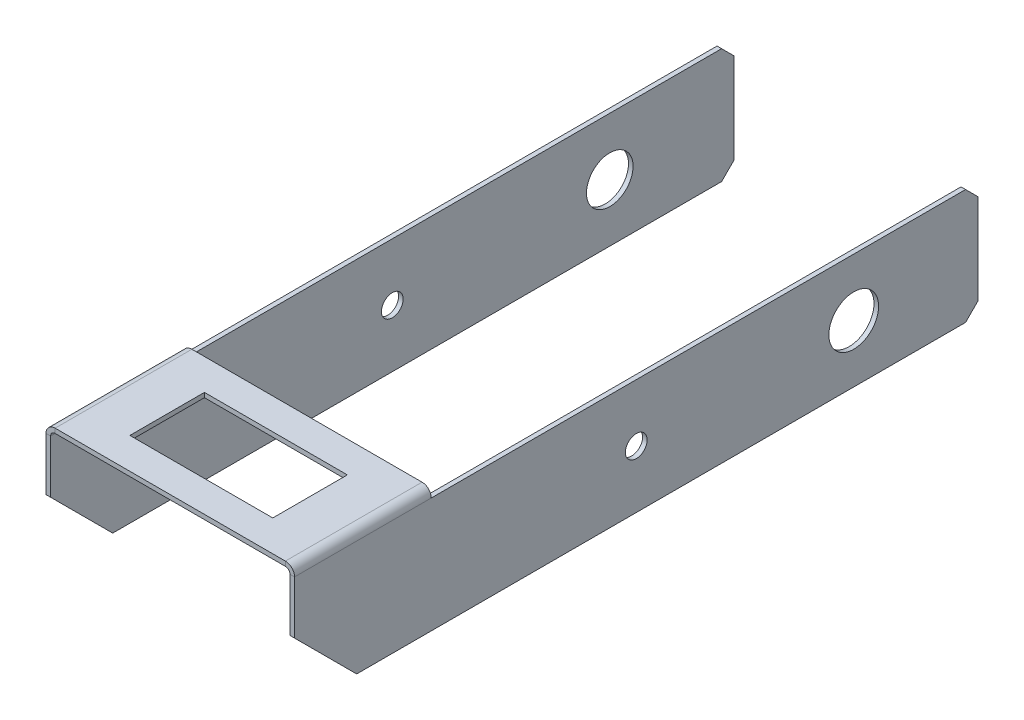
ISO-10303-21;
HEADER;
FILE_DESCRIPTION(('STEP AP214'),'2;1');
FILE_NAME('part.step','',(''),(''),'','','');
FILE_SCHEMA(('AUTOMOTIVE_DESIGN { 1 0 10303 214 1 1 1 1 }'));
ENDSEC;
DATA;
#1=APPLICATION_CONTEXT('core data for automotive mechanical design processes');
#2=APPLICATION_PROTOCOL_DEFINITION('international standard','automotive_design',2000,#1);
#3=PRODUCT_CONTEXT('',#1,'mechanical');
#4=PRODUCT('Part','Part','',(#3));
#5=PRODUCT_RELATED_PRODUCT_CATEGORY('part','',(#4));
#6=PRODUCT_DEFINITION_FORMATION('','',#4);
#7=PRODUCT_DEFINITION_CONTEXT('part definition',#1,'design');
#8=PRODUCT_DEFINITION('design','',#6,#7);
#9=PRODUCT_DEFINITION_SHAPE('','',#8);
#10=(LENGTH_UNIT() NAMED_UNIT(*) SI_UNIT(.MILLI.,.METRE.));
#11=(NAMED_UNIT(*) PLANE_ANGLE_UNIT() SI_UNIT($,.RADIAN.));
#12=(NAMED_UNIT(*) SI_UNIT($,.STERADIAN.) SOLID_ANGLE_UNIT());
#13=UNCERTAINTY_MEASURE_WITH_UNIT(LENGTH_MEASURE(1.E-05),#10,'distance_accuracy_value','');
#14=(GEOMETRIC_REPRESENTATION_CONTEXT(3) GLOBAL_UNCERTAINTY_ASSIGNED_CONTEXT((#13)) GLOBAL_UNIT_ASSIGNED_CONTEXT((#10,
#11,#12)) REPRESENTATION_CONTEXT('',''));
#15=CARTESIAN_POINT('',(0.,0.,0.));
#16=DIRECTION('',(0.,0.,1.));
#17=DIRECTION('',(1.,0.,0.));
#18=AXIS2_PLACEMENT_3D('',#15,#16,#17);
#19=CARTESIAN_POINT('',(-20.,0.7366,-11.));
#20=DIRECTION('',(0.,0.,1.));
#21=DIRECTION('',(1.,0.,0.));
#22=AXIS2_PLACEMENT_3D('',#19,#20,#21);
#23=PLANE('',#22);
#24=DIRECTION('',(0.,1.,0.));
#25=VECTOR('',#24,1.);
#26=CARTESIAN_POINT('',(-18.5268,0.,-11.));
#27=LINE('',#26,#25);
#28=CARTESIAN_POINT('',(-18.5268,0.,-11.));
#29=VERTEX_POINT('',#28);
#30=CARTESIAN_POINT('',(-18.5268,0.736600000000007,-11.));
#31=VERTEX_POINT('',#30);
#32=EDGE_CURVE('E321',#29,#31,#27,.T.);
#33=ORIENTED_EDGE('',*,*,#32,.T.);
#34=DIRECTION('',(-1.,0.,0.));
#35=VECTOR('',#34,1.);
#36=CARTESIAN_POINT('',(-20.,0.7366,-11.));
#37=LINE('',#36,#35);
#38=CARTESIAN_POINT('',(18.5268,0.7366,-11.));
#39=VERTEX_POINT('',#38);
#40=EDGE_CURVE('E398',#39,#31,#37,.T.);
#41=ORIENTED_EDGE('',*,*,#40,.F.);
#42=DIRECTION('',(0.,1.,0.));
#43=VECTOR('',#42,1.);
#44=CARTESIAN_POINT('',(18.5268,0.,-11.));
#45=LINE('',#44,#43);
#46=CARTESIAN_POINT('',(18.5268,0.,-11.));
#47=VERTEX_POINT('',#46);
#48=EDGE_CURVE('E390',#47,#39,#45,.T.);
#49=ORIENTED_EDGE('',*,*,#48,.F.);
#50=DIRECTION('',(-1.,0.,0.));
#51=VECTOR('',#50,1.);
#52=CARTESIAN_POINT('',(-20.,0.,-11.));
#53=LINE('',#52,#51);
#54=EDGE_CURVE('E396',#47,#29,#53,.T.);
#55=ORIENTED_EDGE('',*,*,#54,.T.);
#56=EDGE_LOOP('',(#33,#41,#49,#55));
#57=FACE_BOUND('',#56,.T.);
#58=ADVANCED_FACE('F85',(#57),#23,.F.);
#59=CARTESIAN_POINT('',(-20.,0.7366,11.));
#60=DIRECTION('',(0.,0.,-1.));
#61=DIRECTION('',(-1.,0.,0.));
#62=AXIS2_PLACEMENT_3D('',#59,#60,#61);
#63=PLANE('',#62);
#64=DIRECTION('',(0.,1.,0.));
#65=VECTOR('',#64,1.);
#66=CARTESIAN_POINT('',(-18.5268,0.,11.));
#67=LINE('',#66,#65);
#68=CARTESIAN_POINT('',(-18.5268,0.,11.));
#69=VERTEX_POINT('',#68);
#70=CARTESIAN_POINT('',(-18.5268,0.7366,11.));
#71=VERTEX_POINT('',#70);
#72=EDGE_CURVE('E335',#69,#71,#67,.T.);
#73=ORIENTED_EDGE('',*,*,#72,.F.);
#74=DIRECTION('',(1.,0.,0.));
#75=VECTOR('',#74,1.);
#76=CARTESIAN_POINT('',(-20.,0.,11.));
#77=LINE('',#76,#75);
#78=CARTESIAN_POINT('',(18.5268,0.,11.));
#79=VERTEX_POINT('',#78);
#80=EDGE_CURVE('E401',#69,#79,#77,.T.);
#81=ORIENTED_EDGE('',*,*,#80,.T.);
#82=DIRECTION('',(0.,1.,0.));
#83=VECTOR('',#82,1.);
#84=CARTESIAN_POINT('',(18.5268,0.,11.));
#85=LINE('',#84,#83);
#86=CARTESIAN_POINT('',(18.5268,0.736599999999998,11.));
#87=VERTEX_POINT('',#86);
#88=EDGE_CURVE('E373',#79,#87,#85,.T.);
#89=ORIENTED_EDGE('',*,*,#88,.T.);
#90=DIRECTION('',(1.,0.,0.));
#91=VECTOR('',#90,1.);
#92=CARTESIAN_POINT('',(-20.,0.7366,11.));
#93=LINE('',#92,#91);
#94=EDGE_CURVE('E400',#71,#87,#93,.T.);
#95=ORIENTED_EDGE('',*,*,#94,.F.);
#96=EDGE_LOOP('',(#73,#81,#89,#95));
#97=FACE_BOUND('',#96,.T.);
#98=ADVANCED_FACE('F494',(#97),#63,.F.);
#99=CARTESIAN_POINT('',(0.,0.7366,0.));
#100=DIRECTION('',(0.,-1.,0.));
#101=DIRECTION('',(0.,0.,-1.));
#102=AXIS2_PLACEMENT_3D('',#99,#100,#101);
#103=PLANE('',#102);
#104=DIRECTION('',(-1.,0.,0.));
#105=VECTOR('',#104,1.);
#106=CARTESIAN_POINT('',(-11.5,0.7366,-6.));
#107=LINE('',#106,#105);
#108=CARTESIAN_POINT('',(11.5,0.7366,-6.));
#109=VERTEX_POINT('',#108);
#110=CARTESIAN_POINT('',(-11.5,0.7366,-6.));
#111=VERTEX_POINT('',#110);
#112=EDGE_CURVE('E258',#109,#111,#107,.T.);
#113=ORIENTED_EDGE('',*,*,#112,.F.);
#114=DIRECTION('',(0.,0.,-1.));
#115=VECTOR('',#114,1.);
#116=CARTESIAN_POINT('',(11.5,0.7366,6.));
#117=LINE('',#116,#115);
#118=CARTESIAN_POINT('',(11.5,0.7366,6.));
#119=VERTEX_POINT('',#118);
#120=EDGE_CURVE('E101',#119,#109,#117,.T.);
#121=ORIENTED_EDGE('',*,*,#120,.F.);
#122=DIRECTION('',(1.,0.,0.));
#123=VECTOR('',#122,1.);
#124=CARTESIAN_POINT('',(-11.5,0.7366,6.));
#125=LINE('',#124,#123);
#126=CARTESIAN_POINT('',(-11.5,0.7366,6.));
#127=VERTEX_POINT('',#126);
#128=EDGE_CURVE('E265',#127,#119,#125,.T.);
#129=ORIENTED_EDGE('',*,*,#128,.F.);
#130=DIRECTION('',(0.,0.,1.));
#131=VECTOR('',#130,1.);
#132=CARTESIAN_POINT('',(-11.5,0.7366,6.));
#133=LINE('',#132,#131);
#134=EDGE_CURVE('E249',#111,#127,#133,.T.);
#135=ORIENTED_EDGE('',*,*,#134,.F.);
#136=EDGE_LOOP('',(#113,#121,#129,#135));
#137=FACE_BOUND('',#136,.T.);
#138=DIRECTION('',(0.,0.,-1.));
#139=VECTOR('',#138,1.);
#140=CARTESIAN_POINT('',(-18.5268,0.736600000000007,-11.));
#141=LINE('',#140,#139);
#142=EDGE_CURVE('E315',#31,#71,#141,.F.);
#143=ORIENTED_EDGE('',*,*,#142,.T.);
#144=ORIENTED_EDGE('',*,*,#94,.T.);
#145=DIRECTION('',(0.,0.,1.));
#146=VECTOR('',#145,1.);
#147=CARTESIAN_POINT('',(18.5268,0.736599999999998,11.));
#148=LINE('',#147,#146);
#149=EDGE_CURVE('E367',#87,#39,#148,.F.);
#150=ORIENTED_EDGE('',*,*,#149,.T.);
#151=ORIENTED_EDGE('',*,*,#40,.T.);
#152=EDGE_LOOP('',(#143,#144,#150,#151));
#153=FACE_BOUND('',#152,.T.);
#154=ADVANCED_FACE('F262',(#137,#153),#103,.F.);
#155=CARTESIAN_POINT('',(0.,0.,0.));
#156=DIRECTION('',(0.,-1.,0.));
#157=DIRECTION('',(0.,0.,-1.));
#158=AXIS2_PLACEMENT_3D('',#155,#156,#157);
#159=PLANE('',#158);
#160=DIRECTION('',(0.,0.,1.));
#161=VECTOR('',#160,1.);
#162=CARTESIAN_POINT('',(11.5,0.,0.));
#163=LINE('',#162,#161);
#164=CARTESIAN_POINT('',(11.5,0.,-6.));
#165=VERTEX_POINT('',#164);
#166=CARTESIAN_POINT('',(11.5,0.,6.));
#167=VERTEX_POINT('',#166);
#168=EDGE_CURVE('E13',#165,#167,#163,.T.);
#169=ORIENTED_EDGE('',*,*,#168,.F.);
#170=DIRECTION('',(1.,0.,0.));
#171=VECTOR('',#170,1.);
#172=CARTESIAN_POINT('',(0.,0.,-6.));
#173=LINE('',#172,#171);
#174=CARTESIAN_POINT('',(-11.5,0.,-6.));
#175=VERTEX_POINT('',#174);
#176=EDGE_CURVE('E470',#175,#165,#173,.T.);
#177=ORIENTED_EDGE('',*,*,#176,.F.);
#178=DIRECTION('',(0.,0.,-1.));
#179=VECTOR('',#178,1.);
#180=CARTESIAN_POINT('',(-11.5,0.,0.));
#181=LINE('',#180,#179);
#182=CARTESIAN_POINT('',(-11.5,0.,6.));
#183=VERTEX_POINT('',#182);
#184=EDGE_CURVE('E252',#183,#175,#181,.T.);
#185=ORIENTED_EDGE('',*,*,#184,.F.);
#186=DIRECTION('',(-1.,0.,0.));
#187=VECTOR('',#186,1.);
#188=CARTESIAN_POINT('',(0.,0.,6.));
#189=LINE('',#188,#187);
#190=EDGE_CURVE('E94',#167,#183,#189,.T.);
#191=ORIENTED_EDGE('',*,*,#190,.F.);
#192=EDGE_LOOP('',(#169,#177,#185,#191));
#193=FACE_BOUND('',#192,.T.);
#194=ORIENTED_EDGE('',*,*,#80,.F.);
#195=DIRECTION('',(0.,0.,-1.));
#196=VECTOR('',#195,1.);
#197=CARTESIAN_POINT('',(-18.5268,0.,-11.));
#198=LINE('',#197,#196);
#199=EDGE_CURVE('E330',#29,#69,#198,.F.);
#200=ORIENTED_EDGE('',*,*,#199,.F.);
#201=ORIENTED_EDGE('',*,*,#54,.F.);
#202=DIRECTION('',(0.,0.,1.));
#203=VECTOR('',#202,1.);
#204=CARTESIAN_POINT('',(18.5268,0.,11.));
#205=LINE('',#204,#203);
#206=EDGE_CURVE('E382',#79,#47,#205,.F.);
#207=ORIENTED_EDGE('',*,*,#206,.F.);
#208=EDGE_LOOP('',(#194,#200,#201,#207));
#209=FACE_BOUND('',#208,.T.);
#210=ADVANCED_FACE('F478',(#193,#209),#159,.T.);
#211=CARTESIAN_POINT('',(18.5268,-0.736600000000005,-11.));
#212=DIRECTION('',(0.,0.,-1.));
#213=DIRECTION('',(0.,1.,0.));
#214=AXIS2_PLACEMENT_3D('',#211,#212,#213);
#215=PLANE('',#214);
#216=DIRECTION('',(1.,0.,0.));
#217=VECTOR('',#216,1.);
#218=CARTESIAN_POINT('',(19.2634,-0.736600000000002,-11.));
#219=LINE('',#218,#217);
#220=CARTESIAN_POINT('',(19.2634,-0.736600000000002,-11.));
#221=VERTEX_POINT('',#220);
#222=CARTESIAN_POINT('',(20.,-0.736600000000001,-11.));
#223=VERTEX_POINT('',#222);
#224=EDGE_CURVE('E393',#221,#223,#219,.T.);
#225=ORIENTED_EDGE('',*,*,#224,.F.);
#226=CARTESIAN_POINT('',(18.5268,-0.736600000000005,-11.));
#227=DIRECTION('',(0.,0.,1.));
#228=DIRECTION('',(0.,-1.,0.));
#229=AXIS2_PLACEMENT_3D('',#226,#227,#228);
#230=CIRCLE('',#229,0.7366);
#231=EDGE_CURVE('E377',#47,#221,#230,.F.);
#232=ORIENTED_EDGE('',*,*,#231,.F.);
#233=ORIENTED_EDGE('',*,*,#48,.T.);
#234=CARTESIAN_POINT('',(18.5268,-0.736600000000005,-11.));
#235=DIRECTION('',(0.,0.,1.));
#236=DIRECTION('',(0.,-1.,0.));
#237=AXIS2_PLACEMENT_3D('',#234,#235,#236);
#238=CIRCLE('',#237,1.4732);
#239=EDGE_CURVE('E369',#39,#223,#238,.F.);
#240=ORIENTED_EDGE('',*,*,#239,.T.);
#241=EDGE_LOOP('',(#225,#232,#233,#240));
#242=FACE_BOUND('',#241,.T.);
#243=ADVANCED_FACE('F613',(#242),#215,.T.);
#244=CARTESIAN_POINT('',(18.5268,-0.736600000000002,11.));
#245=DIRECTION('',(0.,0.,-1.));
#246=DIRECTION('',(0.,1.,0.));
#247=AXIS2_PLACEMENT_3D('',#244,#245,#246);
#248=PLANE('',#247);
#249=CARTESIAN_POINT('',(18.5268,-0.736600000000002,11.));
#250=DIRECTION('',(0.,0.,1.));
#251=DIRECTION('',(0.,-1.,0.));
#252=AXIS2_PLACEMENT_3D('',#249,#250,#251);
#253=CIRCLE('',#252,0.7366);
#254=CARTESIAN_POINT('',(19.2634,-0.736599999999999,11.));
#255=VERTEX_POINT('',#254);
#256=EDGE_CURVE('E385',#255,#79,#253,.T.);
#257=ORIENTED_EDGE('',*,*,#256,.F.);
#258=DIRECTION('',(1.,0.,0.));
#259=VECTOR('',#258,1.);
#260=CARTESIAN_POINT('',(19.2634,-0.7366,11.));
#261=LINE('',#260,#259);
#262=CARTESIAN_POINT('',(20.,-0.736599999999997,11.));
#263=VERTEX_POINT('',#262);
#264=EDGE_CURVE('E363',#255,#263,#261,.T.);
#265=ORIENTED_EDGE('',*,*,#264,.T.);
#266=CARTESIAN_POINT('',(18.5268,-0.736600000000002,11.));
#267=DIRECTION('',(0.,0.,1.));
#268=DIRECTION('',(0.,-1.,0.));
#269=AXIS2_PLACEMENT_3D('',#266,#267,#268);
#270=CIRCLE('',#269,1.4732);
#271=EDGE_CURVE('E370',#263,#87,#270,.T.);
#272=ORIENTED_EDGE('',*,*,#271,.T.);
#273=ORIENTED_EDGE('',*,*,#88,.F.);
#274=EDGE_LOOP('',(#257,#265,#272,#273));
#275=FACE_BOUND('',#274,.T.);
#276=ADVANCED_FACE('F575',(#275),#248,.F.);
#277=CARTESIAN_POINT('',(18.5268,-0.736600000000002,11.));
#278=DIRECTION('',(0.,0.,1.));
#279=DIRECTION('',(1.,0.,0.));
#280=AXIS2_PLACEMENT_3D('',#277,#278,#279);
#281=CYLINDRICAL_SURFACE('',#280,1.4732);
#282=ORIENTED_EDGE('',*,*,#149,.F.);
#283=ORIENTED_EDGE('',*,*,#271,.F.);
#284=DIRECTION('',(0.,0.,1.));
#285=VECTOR('',#284,1.);
#286=CARTESIAN_POINT('',(20.,-0.736599999999997,11.));
#287=LINE('',#286,#285);
#288=EDGE_CURVE('E374',#223,#263,#287,.T.);
#289=ORIENTED_EDGE('',*,*,#288,.F.);
#290=ORIENTED_EDGE('',*,*,#239,.F.);
#291=EDGE_LOOP('',(#282,#283,#289,#290));
#292=FACE_BOUND('',#291,.T.);
#293=ADVANCED_FACE('F617',(#292),#281,.T.);
#294=CARTESIAN_POINT('',(18.5268,-0.736600000000002,11.));
#295=DIRECTION('',(0.,0.,1.));
#296=DIRECTION('',(1.,0.,0.));
#297=AXIS2_PLACEMENT_3D('',#294,#295,#296);
#298=CYLINDRICAL_SURFACE('',#297,0.7366);
#299=ORIENTED_EDGE('',*,*,#206,.T.);
#300=ORIENTED_EDGE('',*,*,#231,.T.);
#301=DIRECTION('',(0.,0.,1.));
#302=VECTOR('',#301,1.);
#303=CARTESIAN_POINT('',(19.2634,-0.736599999999999,11.));
#304=LINE('',#303,#302);
#305=EDGE_CURVE('E346',#221,#255,#304,.T.);
#306=ORIENTED_EDGE('',*,*,#305,.T.);
#307=ORIENTED_EDGE('',*,*,#256,.T.);
#308=EDGE_LOOP('',(#299,#300,#306,#307));
#309=FACE_BOUND('',#308,.T.);
#310=ADVANCED_FACE('F579',(#309),#298,.F.);
#311=CARTESIAN_POINT('',(20.,0.,11.));
#312=DIRECTION('',(0.,0.,1.));
#313=DIRECTION('',(1.,0.,0.));
#314=AXIS2_PLACEMENT_3D('',#311,#312,#313);
#315=PLANE('',#314);
#316=DIRECTION('',(0.,-1.,0.));
#317=VECTOR('',#316,1.);
#318=CARTESIAN_POINT('',(19.2634,0.,11.));
#319=LINE('',#318,#317);
#320=CARTESIAN_POINT('',(19.2634,-9.26339999999998,11.));
#321=VERTEX_POINT('',#320);
#322=EDGE_CURVE('E353',#321,#255,#319,.F.);
#323=ORIENTED_EDGE('',*,*,#322,.F.);
#324=DIRECTION('',(1.,0.,0.));
#325=VECTOR('',#324,1.);
#326=CARTESIAN_POINT('',(20.,-9.26339999999998,11.));
#327=LINE('',#326,#325);
#328=CARTESIAN_POINT('',(20.,-9.26339999999998,11.));
#329=VERTEX_POINT('',#328);
#330=EDGE_CURVE('E466',#321,#329,#327,.T.);
#331=ORIENTED_EDGE('',*,*,#330,.T.);
#332=DIRECTION('',(0.,1.,0.));
#333=VECTOR('',#332,1.);
#334=CARTESIAN_POINT('',(20.,0.,11.));
#335=LINE('',#334,#333);
#336=EDGE_CURVE('E344',#329,#263,#335,.T.);
#337=ORIENTED_EDGE('',*,*,#336,.T.);
#338=ORIENTED_EDGE('',*,*,#264,.F.);
#339=EDGE_LOOP('',(#323,#331,#337,#338));
#340=FACE_BOUND('',#339,.T.);
#341=ADVANCED_FACE('F589',(#340),#315,.T.);
#342=CARTESIAN_POINT('',(20.0000000000001,-19.2634,-99.));
#343=DIRECTION('',(0.,0.,-1.));
#344=DIRECTION('',(-1.,0.,0.));
#345=AXIS2_PLACEMENT_3D('',#342,#343,#344);
#346=PLANE('',#345);
#347=DIRECTION('',(0.,-1.,0.));
#348=VECTOR('',#347,1.);
#349=CARTESIAN_POINT('',(20.0000000000001,-19.2634,-99.));
#350=LINE('',#349,#348);
#351=CARTESIAN_POINT('',(20.,-2.7366,-99.));
#352=VERTEX_POINT('',#351);
#353=CARTESIAN_POINT('',(20.0000000000001,-17.2634,-99.));
#354=VERTEX_POINT('',#353);
#355=EDGE_CURVE('E350',#352,#354,#350,.T.);
#356=ORIENTED_EDGE('',*,*,#355,.T.);
#357=DIRECTION('',(-1.,0.,0.));
#358=VECTOR('',#357,1.);
#359=CARTESIAN_POINT('',(20.0000000000001,-17.2634,-99.));
#360=LINE('',#359,#358);
#361=CARTESIAN_POINT('',(19.2634000000001,-17.2634,-99.));
#362=VERTEX_POINT('',#361);
#363=EDGE_CURVE('E434',#354,#362,#360,.T.);
#364=ORIENTED_EDGE('',*,*,#363,.T.);
#365=DIRECTION('',(0.,1.,0.));
#366=VECTOR('',#365,1.);
#367=CARTESIAN_POINT('',(19.2634,0.,-99.));
#368=LINE('',#367,#366);
#369=CARTESIAN_POINT('',(19.2634,-2.7366,-99.));
#370=VERTEX_POINT('',#369);
#371=EDGE_CURVE('E358',#370,#362,#368,.F.);
#372=ORIENTED_EDGE('',*,*,#371,.F.);
#373=DIRECTION('',(1.,0.,0.));
#374=VECTOR('',#373,1.);
#375=CARTESIAN_POINT('',(20.,-2.7366,-99.));
#376=LINE('',#375,#374);
#377=EDGE_CURVE('E431',#370,#352,#376,.T.);
#378=ORIENTED_EDGE('',*,*,#377,.T.);
#379=EDGE_LOOP('',(#356,#364,#372,#378));
#380=FACE_BOUND('',#379,.T.);
#381=ADVANCED_FACE('F604',(#380),#346,.T.);
#382=CARTESIAN_POINT('',(20.,0.,0.));
#383=DIRECTION('',(1.,0.,0.));
#384=DIRECTION('',(0.,1.,0.));
#385=AXIS2_PLACEMENT_3D('',#382,#383,#384);
#386=PLANE('',#385);
#387=CARTESIAN_POINT('',(20.,-10.,-44.));
#388=DIRECTION('',(1.,0.,0.));
#389=DIRECTION('',(0.,1.,0.));
#390=AXIS2_PLACEMENT_3D('',#387,#388,#389);
#391=CIRCLE('',#390,1.75);
#392=CARTESIAN_POINT('',(20.,-8.25,-44.));
#393=VERTEX_POINT('',#392);
#394=EDGE_CURVE('E275',#393,#393,#391,.T.);
#395=ORIENTED_EDGE('',*,*,#394,.F.);
#396=EDGE_LOOP('',(#395));
#397=FACE_BOUND('',#396,.T.);
#398=CARTESIAN_POINT('',(20.,-9.99999999999999,-79.));
#399=DIRECTION('',(1.,0.,0.));
#400=DIRECTION('',(0.,1.,0.));
#401=AXIS2_PLACEMENT_3D('',#398,#399,#400);
#402=CIRCLE('',#401,4.00000000000001);
#403=CARTESIAN_POINT('',(20.,-5.99999999999999,-79.));
#404=VERTEX_POINT('',#403);
#405=EDGE_CURVE('E272',#404,#404,#402,.T.);
#406=ORIENTED_EDGE('',*,*,#405,.F.);
#407=EDGE_LOOP('',(#406));
#408=FACE_BOUND('',#407,.T.);
#409=ORIENTED_EDGE('',*,*,#336,.F.);
#410=DIRECTION('',(0.,0.707106781186549,0.707106781186546));
#411=VECTOR('',#410,1.);
#412=CARTESIAN_POINT('',(20.,-10.1316999999999,10.1317));
#413=LINE('',#412,#411);
#414=CARTESIAN_POINT('',(20.0000000000001,-19.2634,1.00000000000002));
#415=VERTEX_POINT('',#414);
#416=EDGE_CURVE('E468',#329,#415,#413,.F.);
#417=ORIENTED_EDGE('',*,*,#416,.T.);
#418=DIRECTION('',(0.,0.,1.));
#419=VECTOR('',#418,1.);
#420=CARTESIAN_POINT('',(20.0000000000001,-19.2634,11.));
#421=LINE('',#420,#419);
#422=CARTESIAN_POINT('',(20.0000000000001,-19.2634,-97.));
#423=VERTEX_POINT('',#422);
#424=EDGE_CURVE('E347',#423,#415,#421,.T.);
#425=ORIENTED_EDGE('',*,*,#424,.F.);
#426=DIRECTION('',(0.,-0.707106781186545,0.70710678118655));
#427=VECTOR('',#426,1.);
#428=CARTESIAN_POINT('',(20.0000000000002,-58.1317,-58.1316999999997));
#429=LINE('',#428,#427);
#430=EDGE_CURVE('E445',#423,#354,#429,.F.);
#431=ORIENTED_EDGE('',*,*,#430,.T.);
#432=ORIENTED_EDGE('',*,*,#355,.F.);
#433=DIRECTION('',(0.,-0.707106781186545,-0.70710678118655));
#434=VECTOR('',#433,1.);
#435=CARTESIAN_POINT('',(19.9999999999998,48.1317,-48.1316999999996));
#436=LINE('',#435,#434);
#437=CARTESIAN_POINT('',(20.,-0.736600000000012,-97.));
#438=VERTEX_POINT('',#437);
#439=EDGE_CURVE('E443',#352,#438,#436,.F.);
#440=ORIENTED_EDGE('',*,*,#439,.T.);
#441=DIRECTION('',(0.,0.,1.));
#442=VECTOR('',#441,1.);
#443=CARTESIAN_POINT('',(20.,-0.736599999999999,0.));
#444=LINE('',#443,#442);
#445=EDGE_CURVE('E361',#438,#223,#444,.T.);
#446=ORIENTED_EDGE('',*,*,#445,.T.);
#447=ORIENTED_EDGE('',*,*,#288,.T.);
#448=EDGE_LOOP('',(#409,#417,#425,#431,#432,#440,#446,#447));
#449=FACE_BOUND('',#448,.T.);
#450=ADVANCED_FACE('F595',(#397,#408,#449),#386,.T.);
#451=CARTESIAN_POINT('',(19.2634,0.,0.));
#452=DIRECTION('',(1.,0.,0.));
#453=DIRECTION('',(0.,1.,0.));
#454=AXIS2_PLACEMENT_3D('',#451,#452,#453);
#455=PLANE('',#454);
#456=CARTESIAN_POINT('',(19.2634,-10.,-44.));
#457=DIRECTION('',(1.,0.,0.));
#458=DIRECTION('',(0.,1.,0.));
#459=AXIS2_PLACEMENT_3D('',#456,#457,#458);
#460=CIRCLE('',#459,1.75);
#461=CARTESIAN_POINT('',(19.2634,-8.25,-44.));
#462=VERTEX_POINT('',#461);
#463=EDGE_CURVE('E288',#462,#462,#460,.T.);
#464=ORIENTED_EDGE('',*,*,#463,.T.);
#465=EDGE_LOOP('',(#464));
#466=FACE_BOUND('',#465,.T.);
#467=CARTESIAN_POINT('',(19.2634,-9.99999999999999,-79.));
#468=DIRECTION('',(1.,0.,0.));
#469=DIRECTION('',(0.,1.,0.));
#470=AXIS2_PLACEMENT_3D('',#467,#468,#469);
#471=CIRCLE('',#470,4.00000000000001);
#472=CARTESIAN_POINT('',(19.2634,-5.99999999999999,-79.));
#473=VERTEX_POINT('',#472);
#474=EDGE_CURVE('E278',#473,#473,#471,.T.);
#475=ORIENTED_EDGE('',*,*,#474,.T.);
#476=EDGE_LOOP('',(#475));
#477=FACE_BOUND('',#476,.T.);
#478=DIRECTION('',(0.,0.,-1.));
#479=VECTOR('',#478,1.);
#480=CARTESIAN_POINT('',(19.2634000000001,-19.2634,0.));
#481=LINE('',#480,#479);
#482=CARTESIAN_POINT('',(19.2634000000001,-19.2634,-97.));
#483=VERTEX_POINT('',#482);
#484=CARTESIAN_POINT('',(19.2634000000001,-19.2634,1.00000000000002));
#485=VERTEX_POINT('',#484);
#486=EDGE_CURVE('E355',#483,#485,#481,.F.);
#487=ORIENTED_EDGE('',*,*,#486,.T.);
#488=DIRECTION('',(0.,-0.707106781186549,-0.707106781186546));
#489=VECTOR('',#488,1.);
#490=CARTESIAN_POINT('',(19.2634000000001,-19.2634,1.00000000000002));
#491=LINE('',#490,#489);
#492=EDGE_CURVE('E464',#485,#321,#491,.F.);
#493=ORIENTED_EDGE('',*,*,#492,.T.);
#494=ORIENTED_EDGE('',*,*,#322,.T.);
#495=ORIENTED_EDGE('',*,*,#305,.F.);
#496=DIRECTION('',(0.,0.,-1.));
#497=VECTOR('',#496,1.);
#498=CARTESIAN_POINT('',(19.2634,-0.736600000000014,-99.));
#499=LINE('',#498,#497);
#500=CARTESIAN_POINT('',(19.2634,-0.736600000000014,-97.));
#501=VERTEX_POINT('',#500);
#502=EDGE_CURVE('E341',#501,#221,#499,.F.);
#503=ORIENTED_EDGE('',*,*,#502,.F.);
#504=DIRECTION('',(0.,0.707106781186545,0.70710678118655));
#505=VECTOR('',#504,1.);
#506=CARTESIAN_POINT('',(19.2634,-2.7366,-99.));
#507=LINE('',#506,#505);
#508=EDGE_CURVE('E437',#501,#370,#507,.F.);
#509=ORIENTED_EDGE('',*,*,#508,.T.);
#510=ORIENTED_EDGE('',*,*,#371,.T.);
#511=DIRECTION('',(0.,0.707106781186545,-0.70710678118655));
#512=VECTOR('',#511,1.);
#513=CARTESIAN_POINT('',(19.2634000000001,-17.2634,-99.));
#514=LINE('',#513,#512);
#515=EDGE_CURVE('E439',#362,#483,#514,.F.);
#516=ORIENTED_EDGE('',*,*,#515,.T.);
#517=EDGE_LOOP('',(#487,#493,#494,#495,#503,#509,#510,#516));
#518=FACE_BOUND('',#517,.T.);
#519=ADVANCED_FACE('F584',(#466,#477,#518),#455,.F.);
#520=CARTESIAN_POINT('',(20.0000000000001,-19.2634,11.));
#521=DIRECTION('',(0.,-1.,0.));
#522=DIRECTION('',(1.,0.,0.));
#523=AXIS2_PLACEMENT_3D('',#520,#521,#522);
#524=PLANE('',#523);
#525=ORIENTED_EDGE('',*,*,#424,.T.);
#526=DIRECTION('',(-1.,0.,0.));
#527=VECTOR('',#526,1.);
#528=CARTESIAN_POINT('',(20.0000000000001,-19.2634,1.00000000000002));
#529=LINE('',#528,#527);
#530=EDGE_CURVE('E461',#415,#485,#529,.T.);
#531=ORIENTED_EDGE('',*,*,#530,.T.);
#532=ORIENTED_EDGE('',*,*,#486,.F.);
#533=DIRECTION('',(1.,0.,0.));
#534=VECTOR('',#533,1.);
#535=CARTESIAN_POINT('',(20.0000000000001,-19.2634,-97.));
#536=LINE('',#535,#534);
#537=EDGE_CURVE('E441',#483,#423,#536,.T.);
#538=ORIENTED_EDGE('',*,*,#537,.T.);
#539=EDGE_LOOP('',(#525,#531,#532,#538));
#540=FACE_BOUND('',#539,.T.);
#541=ADVANCED_FACE('F598',(#540),#524,.T.);
#542=CARTESIAN_POINT('',(19.2634,-0.736600000000014,-99.));
#543=DIRECTION('',(0.,1.,0.));
#544=DIRECTION('',(-1.,0.,0.));
#545=AXIS2_PLACEMENT_3D('',#542,#543,#544);
#546=PLANE('',#545);
#547=ORIENTED_EDGE('',*,*,#445,.F.);
#548=DIRECTION('',(-1.,0.,0.));
#549=VECTOR('',#548,1.);
#550=CARTESIAN_POINT('',(19.2634,-0.736600000000014,-97.));
#551=LINE('',#550,#549);
#552=EDGE_CURVE('E447',#438,#501,#551,.T.);
#553=ORIENTED_EDGE('',*,*,#552,.T.);
#554=ORIENTED_EDGE('',*,*,#502,.T.);
#555=ORIENTED_EDGE('',*,*,#224,.T.);
#556=EDGE_LOOP('',(#547,#553,#554,#555));
#557=FACE_BOUND('',#556,.T.);
#558=ADVANCED_FACE('F610',(#557),#546,.T.);
#559=CARTESIAN_POINT('',(-18.5268,-0.736599999999998,11.));
#560=DIRECTION('',(0.,0.,1.));
#561=DIRECTION('',(0.,-1.,0.));
#562=AXIS2_PLACEMENT_3D('',#559,#560,#561);
#563=PLANE('',#562);
#564=DIRECTION('',(-1.,0.,0.));
#565=VECTOR('',#564,1.);
#566=CARTESIAN_POINT('',(-20.,-0.736599999999994,11.));
#567=LINE('',#566,#565);
#568=CARTESIAN_POINT('',(-19.2634,-0.736599999999997,11.));
#569=VERTEX_POINT('',#568);
#570=CARTESIAN_POINT('',(-20.,-0.736599999999994,11.));
#571=VERTEX_POINT('',#570);
#572=EDGE_CURVE('E312',#569,#571,#567,.T.);
#573=ORIENTED_EDGE('',*,*,#572,.F.);
#574=CARTESIAN_POINT('',(-18.5268,-0.736599999999998,11.));
#575=DIRECTION('',(0.,0.,-1.));
#576=DIRECTION('',(0.,1.,0.));
#577=AXIS2_PLACEMENT_3D('',#574,#575,#576);
#578=CIRCLE('',#577,0.7366);
#579=EDGE_CURVE('E325',#69,#569,#578,.F.);
#580=ORIENTED_EDGE('',*,*,#579,.F.);
#581=ORIENTED_EDGE('',*,*,#72,.T.);
#582=CARTESIAN_POINT('',(-18.5268,-0.736599999999998,11.));
#583=DIRECTION('',(0.,0.,-1.));
#584=DIRECTION('',(0.,1.,0.));
#585=AXIS2_PLACEMENT_3D('',#582,#583,#584);
#586=CIRCLE('',#585,1.4732);
#587=EDGE_CURVE('E317',#71,#571,#586,.F.);
#588=ORIENTED_EDGE('',*,*,#587,.T.);
#589=EDGE_LOOP('',(#573,#580,#581,#588));
#590=FACE_BOUND('',#589,.T.);
#591=ADVANCED_FACE('F554',(#590),#563,.T.);
#592=CARTESIAN_POINT('',(-18.5268,-0.736599999999993,-11.));
#593=DIRECTION('',(0.,0.,1.));
#594=DIRECTION('',(0.,-1.,0.));
#595=AXIS2_PLACEMENT_3D('',#592,#593,#594);
#596=PLANE('',#595);
#597=CARTESIAN_POINT('',(-18.5268,-0.736599999999993,-11.));
#598=DIRECTION('',(0.,0.,-1.));
#599=DIRECTION('',(0.,1.,0.));
#600=AXIS2_PLACEMENT_3D('',#597,#598,#599);
#601=CIRCLE('',#600,0.7366);
#602=CARTESIAN_POINT('',(-19.2634,-0.736599999999991,-11.));
#603=VERTEX_POINT('',#602);
#604=EDGE_CURVE('E292',#603,#29,#601,.T.);
#605=ORIENTED_EDGE('',*,*,#604,.F.);
#606=DIRECTION('',(-1.,0.,0.));
#607=VECTOR('',#606,1.);
#608=CARTESIAN_POINT('',(-19.2634,-0.73659999999999,-11.));
#609=LINE('',#608,#607);
#610=CARTESIAN_POINT('',(-20.,-0.736599999999988,-11.));
#611=VERTEX_POINT('',#610);
#612=EDGE_CURVE('E338',#603,#611,#609,.T.);
#613=ORIENTED_EDGE('',*,*,#612,.T.);
#614=CARTESIAN_POINT('',(-18.5268,-0.736599999999993,-11.));
#615=DIRECTION('',(0.,0.,-1.));
#616=DIRECTION('',(0.,1.,0.));
#617=AXIS2_PLACEMENT_3D('',#614,#615,#616);
#618=CIRCLE('',#617,1.4732);
#619=EDGE_CURVE('E318',#611,#31,#618,.T.);
#620=ORIENTED_EDGE('',*,*,#619,.T.);
#621=ORIENTED_EDGE('',*,*,#32,.F.);
#622=EDGE_LOOP('',(#605,#613,#620,#621));
#623=FACE_BOUND('',#622,.T.);
#624=ADVANCED_FACE('F566',(#623),#596,.F.);
#625=CARTESIAN_POINT('',(-18.5268,-0.736599999999993,-11.));
#626=DIRECTION('',(0.,0.,-1.));
#627=DIRECTION('',(-1.,0.,0.));
#628=AXIS2_PLACEMENT_3D('',#625,#626,#627);
#629=CYLINDRICAL_SURFACE('',#628,1.4732);
#630=ORIENTED_EDGE('',*,*,#142,.F.);
#631=ORIENTED_EDGE('',*,*,#619,.F.);
#632=DIRECTION('',(0.,0.,-1.));
#633=VECTOR('',#632,1.);
#634=CARTESIAN_POINT('',(-20.,-0.736599999999988,-11.));
#635=LINE('',#634,#633);
#636=EDGE_CURVE('E322',#571,#611,#635,.T.);
#637=ORIENTED_EDGE('',*,*,#636,.F.);
#638=ORIENTED_EDGE('',*,*,#587,.F.);
#639=EDGE_LOOP('',(#630,#631,#637,#638));
#640=FACE_BOUND('',#639,.T.);
#641=ADVANCED_FACE('F569',(#640),#629,.T.);
#642=CARTESIAN_POINT('',(-18.5268,-0.736599999999993,-11.));
#643=DIRECTION('',(0.,0.,-1.));
#644=DIRECTION('',(-1.,0.,0.));
#645=AXIS2_PLACEMENT_3D('',#642,#643,#644);
#646=CYLINDRICAL_SURFACE('',#645,0.7366);
#647=ORIENTED_EDGE('',*,*,#199,.T.);
#648=ORIENTED_EDGE('',*,*,#579,.T.);
#649=DIRECTION('',(0.,0.,-1.));
#650=VECTOR('',#649,1.);
#651=CARTESIAN_POINT('',(-19.2634,-0.736599999999997,11.));
#652=LINE('',#651,#650);
#653=EDGE_CURVE('E308',#569,#603,#652,.T.);
#654=ORIENTED_EDGE('',*,*,#653,.T.);
#655=ORIENTED_EDGE('',*,*,#604,.T.);
#656=EDGE_LOOP('',(#647,#648,#654,#655));
#657=FACE_BOUND('',#656,.T.);
#658=ADVANCED_FACE('F557',(#657),#646,.F.);
#659=CARTESIAN_POINT('',(-19.2634,-0.736599999999997,11.));
#660=DIRECTION('',(0.,1.,0.));
#661=DIRECTION('',(-1.,0.,0.));
#662=AXIS2_PLACEMENT_3D('',#659,#660,#661);
#663=PLANE('',#662);
#664=CARTESIAN_POINT('',(-19.2634,-0.73659999999997,-97.));
#665=VERTEX_POINT('',#664);
#666=EDGE_CURVE('E311',#603,#665,#652,.T.);
#667=ORIENTED_EDGE('',*,*,#666,.T.);
#668=DIRECTION('',(-1.,0.,0.));
#669=VECTOR('',#668,1.);
#670=CARTESIAN_POINT('',(-19.2634,-0.73659999999997,-97.));
#671=LINE('',#670,#669);
#672=CARTESIAN_POINT('',(-20.,-0.736599999999967,-97.));
#673=VERTEX_POINT('',#672);
#674=EDGE_CURVE('E449',#665,#673,#671,.T.);
#675=ORIENTED_EDGE('',*,*,#674,.T.);
#676=DIRECTION('',(0.,0.,-1.));
#677=VECTOR('',#676,1.);
#678=CARTESIAN_POINT('',(-20.,-0.736599999999994,11.));
#679=LINE('',#678,#677);
#680=EDGE_CURVE('E306',#673,#611,#679,.F.);
#681=ORIENTED_EDGE('',*,*,#680,.T.);
#682=ORIENTED_EDGE('',*,*,#612,.F.);
#683=EDGE_LOOP('',(#667,#675,#681,#682));
#684=FACE_BOUND('',#683,.T.);
#685=ADVANCED_FACE('F724',(#684),#663,.T.);
#686=CARTESIAN_POINT('',(-20.,0.,11.));
#687=DIRECTION('',(0.,0.,1.));
#688=DIRECTION('',(1.,0.,0.));
#689=AXIS2_PLACEMENT_3D('',#686,#687,#688);
#690=PLANE('',#689);
#691=DIRECTION('',(0.,1.,0.));
#692=VECTOR('',#691,1.);
#693=CARTESIAN_POINT('',(-20.,0.,11.));
#694=LINE('',#693,#692);
#695=CARTESIAN_POINT('',(-20.,-9.26340000000002,11.));
#696=VERTEX_POINT('',#695);
#697=EDGE_CURVE('E295',#571,#696,#694,.F.);
#698=ORIENTED_EDGE('',*,*,#697,.T.);
#699=DIRECTION('',(1.,0.,0.));
#700=VECTOR('',#699,1.);
#701=CARTESIAN_POINT('',(-20.,-9.26340000000002,11.));
#702=LINE('',#701,#700);
#703=CARTESIAN_POINT('',(-19.2634,-9.26340000000002,11.));
#704=VERTEX_POINT('',#703);
#705=EDGE_CURVE('E452',#696,#704,#702,.T.);
#706=ORIENTED_EDGE('',*,*,#705,.T.);
#707=DIRECTION('',(0.,-1.,0.));
#708=VECTOR('',#707,1.);
#709=CARTESIAN_POINT('',(-19.2634,0.,11.));
#710=LINE('',#709,#708);
#711=EDGE_CURVE('E303',#569,#704,#710,.T.);
#712=ORIENTED_EDGE('',*,*,#711,.F.);
#713=ORIENTED_EDGE('',*,*,#572,.T.);
#714=EDGE_LOOP('',(#698,#706,#712,#713));
#715=FACE_BOUND('',#714,.T.);
#716=ADVANCED_FACE('F549',(#715),#690,.T.);
#717=CARTESIAN_POINT('',(-20.0000000000001,-19.2634,-99.));
#718=DIRECTION('',(0.,0.,-1.));
#719=DIRECTION('',(-1.,0.,0.));
#720=AXIS2_PLACEMENT_3D('',#717,#718,#719);
#721=PLANE('',#720);
#722=DIRECTION('',(0.,1.,0.));
#723=VECTOR('',#722,1.);
#724=CARTESIAN_POINT('',(-19.2634,0.,-99.));
#725=LINE('',#724,#723);
#726=CARTESIAN_POINT('',(-19.2634000000001,-17.2634,-99.));
#727=VERTEX_POINT('',#726);
#728=CARTESIAN_POINT('',(-19.2634,-2.73659999999996,-99.));
#729=VERTEX_POINT('',#728);
#730=EDGE_CURVE('E298',#727,#729,#725,.T.);
#731=ORIENTED_EDGE('',*,*,#730,.F.);
#732=DIRECTION('',(-1.,0.,0.));
#733=VECTOR('',#732,1.);
#734=CARTESIAN_POINT('',(-20.0000000000001,-17.2634,-99.));
#735=LINE('',#734,#733);
#736=CARTESIAN_POINT('',(-20.0000000000001,-17.2634,-99.));
#737=VERTEX_POINT('',#736);
#738=EDGE_CURVE('E424',#727,#737,#735,.T.);
#739=ORIENTED_EDGE('',*,*,#738,.T.);
#740=DIRECTION('',(0.,-1.,0.));
#741=VECTOR('',#740,1.);
#742=CARTESIAN_POINT('',(-20.0000000000001,-19.2634,-99.));
#743=LINE('',#742,#741);
#744=CARTESIAN_POINT('',(-20.,-2.73659999999995,-99.));
#745=VERTEX_POINT('',#744);
#746=EDGE_CURVE('E289',#737,#745,#743,.F.);
#747=ORIENTED_EDGE('',*,*,#746,.T.);
#748=DIRECTION('',(1.,0.,0.));
#749=VECTOR('',#748,1.);
#750=CARTESIAN_POINT('',(-20.,-2.73659999999995,-99.));
#751=LINE('',#750,#749);
#752=EDGE_CURVE('E422',#745,#729,#751,.T.);
#753=ORIENTED_EDGE('',*,*,#752,.T.);
#754=EDGE_LOOP('',(#731,#739,#747,#753));
#755=FACE_BOUND('',#754,.T.);
#756=ADVANCED_FACE('F754',(#755),#721,.T.);
#757=CARTESIAN_POINT('',(-20.,0.,0.));
#758=DIRECTION('',(1.,0.,0.));
#759=DIRECTION('',(0.,1.,0.));
#760=AXIS2_PLACEMENT_3D('',#757,#758,#759);
#761=PLANE('',#760);
#762=CARTESIAN_POINT('',(-20.,-10.,-79.));
#763=DIRECTION('',(-1.,0.,0.));
#764=DIRECTION('',(0.,-1.,0.));
#765=AXIS2_PLACEMENT_3D('',#762,#763,#764);
#766=CIRCLE('',#765,3.75000000000001);
#767=CARTESIAN_POINT('',(-20.0000000000001,-13.75,-79.));
#768=VERTEX_POINT('',#767);
#769=EDGE_CURVE('E281',#768,#768,#766,.T.);
#770=ORIENTED_EDGE('',*,*,#769,.F.);
#771=EDGE_LOOP('',(#770));
#772=FACE_BOUND('',#771,.T.);
#773=CARTESIAN_POINT('',(-20.,-9.99999999999999,-44.));
#774=DIRECTION('',(-1.,0.,0.));
#775=DIRECTION('',(0.,-1.,0.));
#776=AXIS2_PLACEMENT_3D('',#773,#774,#775);
#777=CIRCLE('',#776,1.75);
#778=CARTESIAN_POINT('',(-20.,-11.75,-44.));
#779=VERTEX_POINT('',#778);
#780=EDGE_CURVE('E285',#779,#779,#777,.T.);
#781=ORIENTED_EDGE('',*,*,#780,.F.);
#782=EDGE_LOOP('',(#781));
#783=FACE_BOUND('',#782,.T.);
#784=DIRECTION('',(0.,0.,1.));
#785=VECTOR('',#784,1.);
#786=CARTESIAN_POINT('',(-20.0000000000001,-19.2634,11.));
#787=LINE('',#786,#785);
#788=CARTESIAN_POINT('',(-20.0000000000001,-19.2634,0.999999999999977));
#789=VERTEX_POINT('',#788);
#790=CARTESIAN_POINT('',(-20.0000000000001,-19.2634,-97.));
#791=VERTEX_POINT('',#790);
#792=EDGE_CURVE('E293',#789,#791,#787,.F.);
#793=ORIENTED_EDGE('',*,*,#792,.F.);
#794=DIRECTION('',(0.,-0.707106781186546,-0.707106781186549));
#795=VECTOR('',#794,1.);
#796=CARTESIAN_POINT('',(-20.,-9.26340000000002,11.));
#797=LINE('',#796,#795);
#798=EDGE_CURVE('E459',#789,#696,#797,.F.);
#799=ORIENTED_EDGE('',*,*,#798,.T.);
#800=ORIENTED_EDGE('',*,*,#697,.F.);
#801=ORIENTED_EDGE('',*,*,#636,.T.);
#802=ORIENTED_EDGE('',*,*,#680,.F.);
#803=DIRECTION('',(0.,0.70710678118655,0.707106781186545));
#804=VECTOR('',#803,1.);
#805=CARTESIAN_POINT('',(-20.,-0.736599999999967,-97.));
#806=LINE('',#805,#804);
#807=EDGE_CURVE('E426',#673,#745,#806,.F.);
#808=ORIENTED_EDGE('',*,*,#807,.T.);
#809=ORIENTED_EDGE('',*,*,#746,.F.);
#810=DIRECTION('',(0.,0.70710678118655,-0.707106781186545));
#811=VECTOR('',#810,1.);
#812=CARTESIAN_POINT('',(-20.0000000000001,-19.2634,-97.));
#813=LINE('',#812,#811);
#814=EDGE_CURVE('E428',#737,#791,#813,.F.);
#815=ORIENTED_EDGE('',*,*,#814,.T.);
#816=EDGE_LOOP('',(#793,#799,#800,#801,#802,#808,#809,#815));
#817=FACE_BOUND('',#816,.T.);
#818=ADVANCED_FACE('F546',(#772,#783,#817),#761,.F.);
#819=CARTESIAN_POINT('',(-19.2634,0.,0.));
#820=DIRECTION('',(1.,0.,0.));
#821=DIRECTION('',(0.,1.,0.));
#822=AXIS2_PLACEMENT_3D('',#819,#820,#821);
#823=PLANE('',#822);
#824=CARTESIAN_POINT('',(-19.2634,-10.,-79.));
#825=DIRECTION('',(1.,0.,0.));
#826=DIRECTION('',(0.,1.,0.));
#827=AXIS2_PLACEMENT_3D('',#824,#825,#826);
#828=CIRCLE('',#827,3.75000000000001);
#829=CARTESIAN_POINT('',(-19.2634,-6.25,-79.));
#830=VERTEX_POINT('',#829);
#831=EDGE_CURVE('E314',#830,#830,#828,.T.);
#832=ORIENTED_EDGE('',*,*,#831,.F.);
#833=EDGE_LOOP('',(#832));
#834=FACE_BOUND('',#833,.T.);
#835=CARTESIAN_POINT('',(-19.2634,-9.99999999999999,-44.));
#836=DIRECTION('',(1.,0.,0.));
#837=DIRECTION('',(0.,1.,0.));
#838=AXIS2_PLACEMENT_3D('',#835,#836,#837);
#839=CIRCLE('',#838,1.75);
#840=CARTESIAN_POINT('',(-19.2634,-8.24999999999999,-44.));
#841=VERTEX_POINT('',#840);
#842=EDGE_CURVE('E284',#841,#841,#839,.T.);
#843=ORIENTED_EDGE('',*,*,#842,.F.);
#844=EDGE_LOOP('',(#843));
#845=FACE_BOUND('',#844,.T.);
#846=ORIENTED_EDGE('',*,*,#711,.T.);
#847=DIRECTION('',(0.,0.707106781186546,0.707106781186549));
#848=VECTOR('',#847,1.);
#849=CARTESIAN_POINT('',(-19.2634,-10.1317,10.1317));
#850=LINE('',#849,#848);
#851=CARTESIAN_POINT('',(-19.2634000000001,-19.2634,0.999999999999977));
#852=VERTEX_POINT('',#851);
#853=EDGE_CURVE('E455',#704,#852,#850,.F.);
#854=ORIENTED_EDGE('',*,*,#853,.T.);
#855=DIRECTION('',(0.,0.,-1.));
#856=VECTOR('',#855,1.);
#857=CARTESIAN_POINT('',(-19.2634000000001,-19.2634,0.));
#858=LINE('',#857,#856);
#859=CARTESIAN_POINT('',(-19.2634000000001,-19.2634,-97.));
#860=VERTEX_POINT('',#859);
#861=EDGE_CURVE('E301',#852,#860,#858,.T.);
#862=ORIENTED_EDGE('',*,*,#861,.T.);
#863=DIRECTION('',(0.,-0.70710678118655,0.707106781186545));
#864=VECTOR('',#863,1.);
#865=CARTESIAN_POINT('',(-19.2634000000002,-58.1316999999999,-58.1317000000004));
#866=LINE('',#865,#864);
#867=EDGE_CURVE('E420',#860,#727,#866,.F.);
#868=ORIENTED_EDGE('',*,*,#867,.T.);
#869=ORIENTED_EDGE('',*,*,#730,.T.);
#870=DIRECTION('',(0.,-0.70710678118655,-0.707106781186545));
#871=VECTOR('',#870,1.);
#872=CARTESIAN_POINT('',(-19.2633999999998,48.1317000000001,-48.1317000000003));
#873=LINE('',#872,#871);
#874=EDGE_CURVE('E418',#729,#665,#873,.F.);
#875=ORIENTED_EDGE('',*,*,#874,.T.);
#876=ORIENTED_EDGE('',*,*,#666,.F.);
#877=ORIENTED_EDGE('',*,*,#653,.F.);
#878=EDGE_LOOP('',(#846,#854,#862,#868,#869,#875,#876,#877));
#879=FACE_BOUND('',#878,.T.);
#880=ADVANCED_FACE('F737',(#834,#845,#879),#823,.T.);
#881=CARTESIAN_POINT('',(-20.0000000000001,-19.2634,11.));
#882=DIRECTION('',(0.,-1.,0.));
#883=DIRECTION('',(1.,0.,0.));
#884=AXIS2_PLACEMENT_3D('',#881,#882,#883);
#885=PLANE('',#884);
#886=ORIENTED_EDGE('',*,*,#861,.F.);
#887=DIRECTION('',(-1.,0.,0.));
#888=VECTOR('',#887,1.);
#889=CARTESIAN_POINT('',(-20.0000000000001,-19.2634,0.999999999999977));
#890=LINE('',#889,#888);
#891=EDGE_CURVE('E457',#852,#789,#890,.T.);
#892=ORIENTED_EDGE('',*,*,#891,.T.);
#893=ORIENTED_EDGE('',*,*,#792,.T.);
#894=DIRECTION('',(1.,0.,0.));
#895=VECTOR('',#894,1.);
#896=CARTESIAN_POINT('',(-20.0000000000001,-19.2634,-97.));
#897=LINE('',#896,#895);
#898=EDGE_CURVE('E404',#791,#860,#897,.T.);
#899=ORIENTED_EDGE('',*,*,#898,.T.);
#900=EDGE_LOOP('',(#886,#892,#893,#899));
#901=FACE_BOUND('',#900,.T.);
#902=ADVANCED_FACE('F718',(#901),#885,.T.);
#903=CARTESIAN_POINT('',(-18.,-10.,-44.));
#904=DIRECTION('',(-1.,0.,0.));
#905=DIRECTION('',(0.,-1.,0.));
#906=AXIS2_PLACEMENT_3D('',#903,#904,#905);
#907=CYLINDRICAL_SURFACE('',#906,1.75);
#908=ORIENTED_EDGE('',*,*,#842,.T.);
#909=EDGE_LOOP('',(#908));
#910=FACE_BOUND('',#909,.T.);
#911=ORIENTED_EDGE('',*,*,#780,.T.);
#912=EDGE_LOOP('',(#911));
#913=FACE_BOUND('',#912,.T.);
#914=ADVANCED_FACE('F709',(#910,#913),#907,.F.);
#915=CARTESIAN_POINT('',(-18.,-10.,-79.));
#916=DIRECTION('',(-1.,0.,0.));
#917=DIRECTION('',(0.,-1.,0.));
#918=AXIS2_PLACEMENT_3D('',#915,#916,#917);
#919=CYLINDRICAL_SURFACE('',#918,3.75000000000001);
#920=ORIENTED_EDGE('',*,*,#831,.T.);
#921=EDGE_LOOP('',(#920));
#922=FACE_BOUND('',#921,.T.);
#923=ORIENTED_EDGE('',*,*,#769,.T.);
#924=EDGE_LOOP('',(#923));
#925=FACE_BOUND('',#924,.T.);
#926=ADVANCED_FACE('F700',(#922,#925),#919,.F.);
#927=CARTESIAN_POINT('',(18.,-10.,-79.));
#928=DIRECTION('',(1.,0.,0.));
#929=DIRECTION('',(0.,1.,0.));
#930=AXIS2_PLACEMENT_3D('',#927,#928,#929);
#931=CYLINDRICAL_SURFACE('',#930,4.00000000000001);
#932=ORIENTED_EDGE('',*,*,#405,.T.);
#933=EDGE_LOOP('',(#932));
#934=FACE_BOUND('',#933,.T.);
#935=ORIENTED_EDGE('',*,*,#474,.F.);
#936=EDGE_LOOP('',(#935));
#937=FACE_BOUND('',#936,.T.);
#938=ADVANCED_FACE('F691',(#934,#937),#931,.F.);
#939=CARTESIAN_POINT('',(18.,-10.,-44.));
#940=DIRECTION('',(1.,0.,0.));
#941=DIRECTION('',(0.,1.,0.));
#942=AXIS2_PLACEMENT_3D('',#939,#940,#941);
#943=CYLINDRICAL_SURFACE('',#942,1.75);
#944=ORIENTED_EDGE('',*,*,#394,.T.);
#945=EDGE_LOOP('',(#944));
#946=FACE_BOUND('',#945,.T.);
#947=ORIENTED_EDGE('',*,*,#463,.F.);
#948=EDGE_LOOP('',(#947));
#949=FACE_BOUND('',#948,.T.);
#950=ADVANCED_FACE('F512',(#946,#949),#943,.F.);
#951=CARTESIAN_POINT('',(-20.0000000000001,-19.2634,-97.));
#952=DIRECTION('',(0.,0.707106781186545,0.70710678118655));
#953=DIRECTION('',(1.,0.,0.));
#954=AXIS2_PLACEMENT_3D('',#951,#952,#953);
#955=PLANE('',#954);
#956=ORIENTED_EDGE('',*,*,#814,.F.);
#957=ORIENTED_EDGE('',*,*,#738,.F.);
#958=ORIENTED_EDGE('',*,*,#867,.F.);
#959=ORIENTED_EDGE('',*,*,#898,.F.);
#960=EDGE_LOOP('',(#956,#957,#958,#959));
#961=FACE_BOUND('',#960,.T.);
#962=ADVANCED_FACE('F505',(#961),#955,.F.);
#963=CARTESIAN_POINT('',(20.0000000000001,-17.2634,-99.));
#964=DIRECTION('',(0.,0.70710678118655,0.707106781186545));
#965=DIRECTION('',(-1.,0.,0.));
#966=AXIS2_PLACEMENT_3D('',#963,#964,#965);
#967=PLANE('',#966);
#968=ORIENTED_EDGE('',*,*,#430,.F.);
#969=ORIENTED_EDGE('',*,*,#537,.F.);
#970=ORIENTED_EDGE('',*,*,#515,.F.);
#971=ORIENTED_EDGE('',*,*,#363,.F.);
#972=EDGE_LOOP('',(#968,#969,#970,#971));
#973=FACE_BOUND('',#972,.T.);
#974=ADVANCED_FACE('F511',(#973),#967,.F.);
#975=CARTESIAN_POINT('',(20.,-2.7366,-99.));
#976=DIRECTION('',(0.,-0.70710678118655,0.707106781186545));
#977=DIRECTION('',(1.,0.,0.));
#978=AXIS2_PLACEMENT_3D('',#975,#976,#977);
#979=PLANE('',#978);
#980=ORIENTED_EDGE('',*,*,#508,.F.);
#981=ORIENTED_EDGE('',*,*,#552,.F.);
#982=ORIENTED_EDGE('',*,*,#439,.F.);
#983=ORIENTED_EDGE('',*,*,#377,.F.);
#984=EDGE_LOOP('',(#980,#981,#982,#983));
#985=FACE_BOUND('',#984,.T.);
#986=ADVANCED_FACE('F519',(#985),#979,.F.);
#987=CARTESIAN_POINT('',(-19.2634,-0.73659999999997,-97.));
#988=DIRECTION('',(0.,-0.707106781186545,0.70710678118655));
#989=DIRECTION('',(-1.,0.,0.));
#990=AXIS2_PLACEMENT_3D('',#987,#988,#989);
#991=PLANE('',#990);
#992=ORIENTED_EDGE('',*,*,#874,.F.);
#993=ORIENTED_EDGE('',*,*,#752,.F.);
#994=ORIENTED_EDGE('',*,*,#807,.F.);
#995=ORIENTED_EDGE('',*,*,#674,.F.);
#996=EDGE_LOOP('',(#992,#993,#994,#995));
#997=FACE_BOUND('',#996,.T.);
#998=ADVANCED_FACE('F526',(#997),#991,.F.);
#999=CARTESIAN_POINT('',(-20.,-9.26340000000002,11.));
#1000=DIRECTION('',(0.,0.707106781186549,-0.707106781186546));
#1001=DIRECTION('',(1.,0.,0.));
#1002=AXIS2_PLACEMENT_3D('',#999,#1000,#1001);
#1003=PLANE('',#1002);
#1004=ORIENTED_EDGE('',*,*,#798,.F.);
#1005=ORIENTED_EDGE('',*,*,#891,.F.);
#1006=ORIENTED_EDGE('',*,*,#853,.F.);
#1007=ORIENTED_EDGE('',*,*,#705,.F.);
#1008=EDGE_LOOP('',(#1004,#1005,#1006,#1007));
#1009=FACE_BOUND('',#1008,.T.);
#1010=ADVANCED_FACE('F489',(#1009),#1003,.F.);
#1011=CARTESIAN_POINT('',(20.0000000000001,-19.2634,1.00000000000002));
#1012=DIRECTION('',(0.,0.707106781186546,-0.707106781186549));
#1013=DIRECTION('',(-1.,0.,0.));
#1014=AXIS2_PLACEMENT_3D('',#1011,#1012,#1013);
#1015=PLANE('',#1014);
#1016=ORIENTED_EDGE('',*,*,#416,.F.);
#1017=ORIENTED_EDGE('',*,*,#330,.F.);
#1018=ORIENTED_EDGE('',*,*,#492,.F.);
#1019=ORIENTED_EDGE('',*,*,#530,.F.);
#1020=EDGE_LOOP('',(#1016,#1017,#1018,#1019));
#1021=FACE_BOUND('',#1020,.T.);
#1022=ADVANCED_FACE('F88',(#1021),#1015,.F.);
#1023=CARTESIAN_POINT('',(11.5,-1.2634,6.));
#1024=DIRECTION('',(1.,0.,0.));
#1025=DIRECTION('',(0.,0.,-1.));
#1026=AXIS2_PLACEMENT_3D('',#1023,#1024,#1025);
#1027=PLANE('',#1026);
#1028=ORIENTED_EDGE('',*,*,#168,.T.);
#1029=DIRECTION('',(0.,1.,0.));
#1030=VECTOR('',#1029,1.);
#1031=CARTESIAN_POINT('',(11.5,-1.2634,6.));
#1032=LINE('',#1031,#1030);
#1033=EDGE_CURVE('E270',#167,#119,#1032,.T.);
#1034=ORIENTED_EDGE('',*,*,#1033,.T.);
#1035=ORIENTED_EDGE('',*,*,#120,.T.);
#1036=DIRECTION('',(0.,1.,0.));
#1037=VECTOR('',#1036,1.);
#1038=CARTESIAN_POINT('',(11.5,-1.2634,-6.));
#1039=LINE('',#1038,#1037);
#1040=EDGE_CURVE('E255',#165,#109,#1039,.T.);
#1041=ORIENTED_EDGE('',*,*,#1040,.F.);
#1042=EDGE_LOOP('',(#1028,#1034,#1035,#1041));
#1043=FACE_BOUND('',#1042,.T.);
#1044=ADVANCED_FACE('F480',(#1043),#1027,.F.);
#1045=CARTESIAN_POINT('',(-11.5,-1.2634,6.));
#1046=DIRECTION('',(0.,0.,1.));
#1047=DIRECTION('',(1.,0.,0.));
#1048=AXIS2_PLACEMENT_3D('',#1045,#1046,#1047);
#1049=PLANE('',#1048);
#1050=ORIENTED_EDGE('',*,*,#190,.T.);
#1051=DIRECTION('',(0.,1.,0.));
#1052=VECTOR('',#1051,1.);
#1053=CARTESIAN_POINT('',(-11.5,-1.2634,6.));
#1054=LINE('',#1053,#1052);
#1055=EDGE_CURVE('E254',#183,#127,#1054,.T.);
#1056=ORIENTED_EDGE('',*,*,#1055,.T.);
#1057=ORIENTED_EDGE('',*,*,#128,.T.);
#1058=ORIENTED_EDGE('',*,*,#1033,.F.);
#1059=EDGE_LOOP('',(#1050,#1056,#1057,#1058));
#1060=FACE_BOUND('',#1059,.T.);
#1061=ADVANCED_FACE('F475',(#1060),#1049,.F.);
#1062=CARTESIAN_POINT('',(-11.5,-1.2634,6.));
#1063=DIRECTION('',(-1.,0.,0.));
#1064=DIRECTION('',(0.,0.,1.));
#1065=AXIS2_PLACEMENT_3D('',#1062,#1063,#1064);
#1066=PLANE('',#1065);
#1067=ORIENTED_EDGE('',*,*,#184,.T.);
#1068=DIRECTION('',(0.,1.,0.));
#1069=VECTOR('',#1068,1.);
#1070=CARTESIAN_POINT('',(-11.5,-1.2634,-6.));
#1071=LINE('',#1070,#1069);
#1072=EDGE_CURVE('E109',#175,#111,#1071,.T.);
#1073=ORIENTED_EDGE('',*,*,#1072,.T.);
#1074=ORIENTED_EDGE('',*,*,#134,.T.);
#1075=ORIENTED_EDGE('',*,*,#1055,.F.);
#1076=EDGE_LOOP('',(#1067,#1073,#1074,#1075));
#1077=FACE_BOUND('',#1076,.T.);
#1078=ADVANCED_FACE('F246',(#1077),#1066,.F.);
#1079=CARTESIAN_POINT('',(-11.5,-1.2634,-6.));
#1080=DIRECTION('',(0.,0.,-1.));
#1081=DIRECTION('',(-1.,0.,0.));
#1082=AXIS2_PLACEMENT_3D('',#1079,#1080,#1081);
#1083=PLANE('',#1082);
#1084=ORIENTED_EDGE('',*,*,#176,.T.);
#1085=ORIENTED_EDGE('',*,*,#1040,.T.);
#1086=ORIENTED_EDGE('',*,*,#112,.T.);
#1087=ORIENTED_EDGE('',*,*,#1072,.F.);
#1088=EDGE_LOOP('',(#1084,#1085,#1086,#1087));
#1089=FACE_BOUND('',#1088,.T.);
#1090=ADVANCED_FACE('F259',(#1089),#1083,.F.);
#1091=CLOSED_SHELL('',(#58,#98,#154,#210,#243,#276,#293,#310,#341,#381,#450,#519,#541,#558,#591,
#624,#641,#658,#685,#716,#756,#818,#880,#902,#914,#926,#938,#950,#962,#974,#986,#998,#1010,
#1022,#1044,#1061,#1078,#1090));
#1092=MANIFOLD_SOLID_BREP('B2',#1091);
#1093=ADVANCED_BREP_SHAPE_REPRESENTATION('',(#18,#1092),#14);
#1094=SHAPE_DEFINITION_REPRESENTATION(#9,#1093);
ENDSEC;
END-ISO-10303-21;
